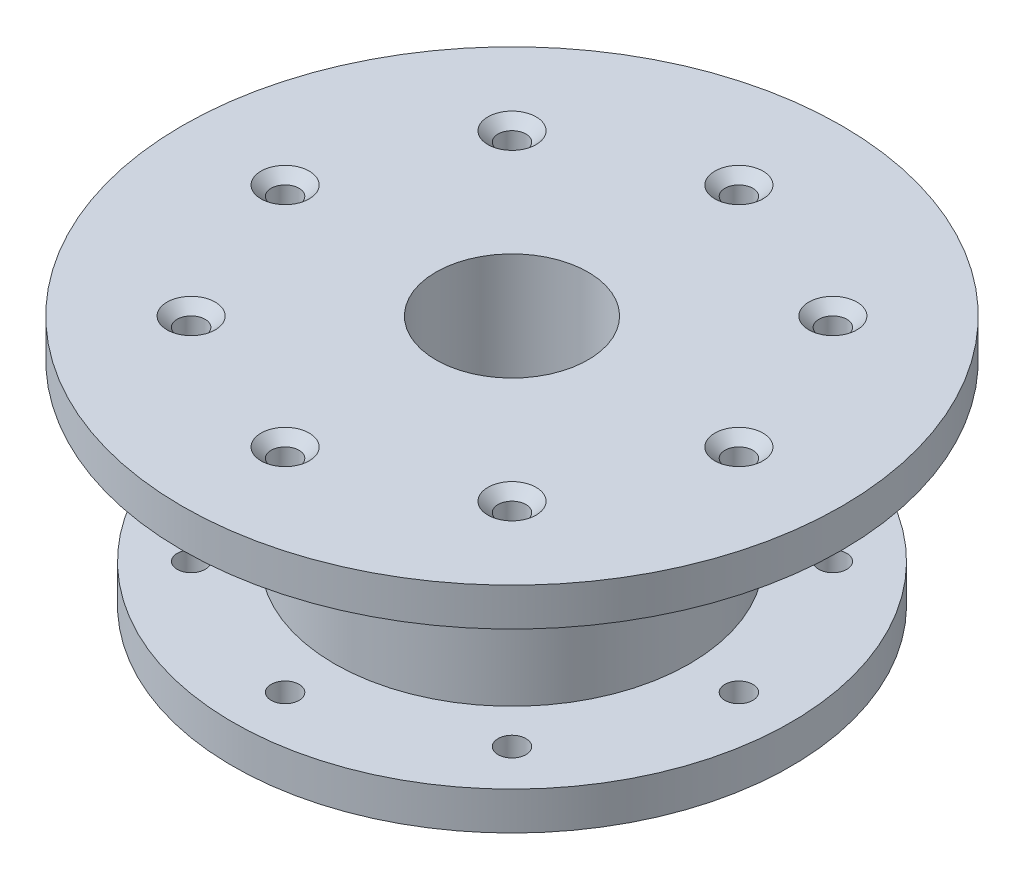
ISO-10303-21;
HEADER;
FILE_DESCRIPTION(('STEP AP214'),'2;1');
FILE_NAME('part.step','',(''),(''),'','','');
FILE_SCHEMA(('AUTOMOTIVE_DESIGN { 1 0 10303 214 1 1 1 1 }'));
ENDSEC;
DATA;
#1=APPLICATION_CONTEXT('core data for automotive mechanical design processes');
#2=APPLICATION_PROTOCOL_DEFINITION('international standard','automotive_design',2000,#1);
#3=PRODUCT_CONTEXT('',#1,'mechanical');
#4=PRODUCT('Part','Part','',(#3));
#5=PRODUCT_RELATED_PRODUCT_CATEGORY('part','',(#4));
#6=PRODUCT_DEFINITION_FORMATION('','',#4);
#7=PRODUCT_DEFINITION_CONTEXT('part definition',#1,'design');
#8=PRODUCT_DEFINITION('design','',#6,#7);
#9=PRODUCT_DEFINITION_SHAPE('','',#8);
#10=(LENGTH_UNIT() NAMED_UNIT(*) SI_UNIT(.MILLI.,.METRE.));
#11=(NAMED_UNIT(*) PLANE_ANGLE_UNIT() SI_UNIT($,.RADIAN.));
#12=(NAMED_UNIT(*) SI_UNIT($,.STERADIAN.) SOLID_ANGLE_UNIT());
#13=UNCERTAINTY_MEASURE_WITH_UNIT(LENGTH_MEASURE(1.E-05),#10,'distance_accuracy_value','');
#14=(GEOMETRIC_REPRESENTATION_CONTEXT(3) GLOBAL_UNCERTAINTY_ASSIGNED_CONTEXT((#13)) GLOBAL_UNIT_ASSIGNED_CONTEXT((#10,
#11,#12)) REPRESENTATION_CONTEXT('',''));
#15=CARTESIAN_POINT('',(0.,0.,0.));
#16=DIRECTION('',(0.,0.,1.));
#17=DIRECTION('',(1.,0.,0.));
#18=AXIS2_PLACEMENT_3D('',#15,#16,#17);
#19=CARTESIAN_POINT('',(13.1062182346386,42.025554223453,0.));
#20=DIRECTION('',(0.,-1.,0.));
#21=DIRECTION('',(1.,0.,0.));
#22=AXIS2_PLACEMENT_3D('',#19,#20,#21);
#23=PLANE('',#22);
#24=CARTESIAN_POINT('',(-16.8937817653604,42.025554223453,89.4603042940639));
#25=DIRECTION('',(0.,1.,0.));
#26=DIRECTION('',(0.,0.,1.));
#27=AXIS2_PLACEMENT_3D('',#24,#25,#26);
#28=CIRCLE('',#27,9.5);
#29=CARTESIAN_POINT('',(-16.8937817653604,42.025554223453,98.9603042940639));
#30=VERTEX_POINT('',#29);
#31=EDGE_CURVE('E333',#30,#30,#28,.T.);
#32=ORIENTED_EDGE('',*,*,#31,.F.);
#33=EDGE_LOOP('',(#32));
#34=FACE_BOUND('',#33,.T.);
#35=CARTESIAN_POINT('',(-106.354086059425,42.025554223453,0.));
#36=DIRECTION('',(0.,1.,0.));
#37=DIRECTION('',(0.,0.,1.));
#38=AXIS2_PLACEMENT_3D('',#35,#36,#37);
#39=CIRCLE('',#38,9.49999999999999);
#40=CARTESIAN_POINT('',(-106.354086059425,42.025554223453,9.49999999999999));
#41=VERTEX_POINT('',#40);
#42=EDGE_CURVE('E101',#41,#41,#39,.T.);
#43=ORIENTED_EDGE('',*,*,#42,.F.);
#44=EDGE_LOOP('',(#43));
#45=FACE_BOUND('',#44,.T.);
#46=CARTESIAN_POINT('',(-16.8937817653617,42.025554223453,-89.4603042940639));
#47=DIRECTION('',(0.,1.,0.));
#48=DIRECTION('',(0.,0.,1.));
#49=AXIS2_PLACEMENT_3D('',#46,#47,#48);
#50=CIRCLE('',#49,9.5);
#51=CARTESIAN_POINT('',(-16.8937817653617,42.025554223453,-79.9603042940639));
#52=VERTEX_POINT('',#51);
#53=EDGE_CURVE('E141',#52,#52,#50,.T.);
#54=ORIENTED_EDGE('',*,*,#53,.F.);
#55=EDGE_LOOP('',(#54));
#56=FACE_BOUND('',#55,.T.);
#57=CARTESIAN_POINT('',(46.3642060479831,42.025554223453,-63.2579878133447));
#58=DIRECTION('',(0.,1.,0.));
#59=DIRECTION('',(0.,0.,1.));
#60=AXIS2_PLACEMENT_3D('',#57,#58,#59);
#61=CIRCLE('',#60,9.5);
#62=CARTESIAN_POINT('',(46.3642060479831,42.025554223453,-53.7579878133447));
#63=VERTEX_POINT('',#62);
#64=EDGE_CURVE('E155',#63,#63,#61,.T.);
#65=ORIENTED_EDGE('',*,*,#64,.F.);
#66=EDGE_LOOP('',(#65));
#67=FACE_BOUND('',#66,.T.);
#68=CARTESIAN_POINT('',(72.5665225287025,42.025554223453,0.));
#69=DIRECTION('',(0.,1.,0.));
#70=DIRECTION('',(0.,0.,1.));
#71=AXIS2_PLACEMENT_3D('',#68,#69,#70);
#72=CIRCLE('',#71,9.49999999999999);
#73=CARTESIAN_POINT('',(72.5665225287025,42.025554223453,9.49999999999999));
#74=VERTEX_POINT('',#73);
#75=EDGE_CURVE('E169',#74,#74,#72,.T.);
#76=ORIENTED_EDGE('',*,*,#75,.F.);
#77=EDGE_LOOP('',(#76));
#78=FACE_BOUND('',#77,.T.);
#79=CARTESIAN_POINT('',(-16.8937817653614,42.025554223453,0.));
#80=DIRECTION('',(0.,1.,0.));
#81=DIRECTION('',(-1.,0.,0.));
#82=AXIS2_PLACEMENT_3D('',#79,#80,#81);
#83=CIRCLE('',#82,30.);
#84=CARTESIAN_POINT('',(-46.8937817653614,42.025554223453,0.));
#85=VERTEX_POINT('',#84);
#86=EDGE_CURVE('E183',#85,#85,#83,.T.);
#87=ORIENTED_EDGE('',*,*,#86,.F.);
#88=EDGE_LOOP('',(#87));
#89=FACE_BOUND('',#88,.T.);
#90=CARTESIAN_POINT('',(-16.8937817653614,42.025554223453,0.));
#91=DIRECTION('',(0.,1.,0.));
#92=DIRECTION('',(-1.,0.,0.));
#93=AXIS2_PLACEMENT_3D('',#90,#91,#92);
#94=CIRCLE('',#93,130.);
#95=CARTESIAN_POINT('',(-146.893781765361,42.025554223453,0.));
#96=VERTEX_POINT('',#95);
#97=EDGE_CURVE('E187',#96,#96,#94,.T.);
#98=ORIENTED_EDGE('',*,*,#97,.T.);
#99=EDGE_LOOP('',(#98));
#100=FACE_BOUND('',#99,.T.);
#101=CARTESIAN_POINT('',(-80.1517695787063,42.025554223453,-63.2579878133443));
#102=DIRECTION('',(0.,1.,0.));
#103=DIRECTION('',(0.,0.,1.));
#104=AXIS2_PLACEMENT_3D('',#101,#102,#103);
#105=CIRCLE('',#104,9.49999999999999);
#106=CARTESIAN_POINT('',(-80.1517695787063,42.025554223453,-53.7579878133443));
#107=VERTEX_POINT('',#106);
#108=EDGE_CURVE('E127',#107,#107,#105,.T.);
#109=ORIENTED_EDGE('',*,*,#108,.F.);
#110=EDGE_LOOP('',(#109));
#111=FACE_BOUND('',#110,.T.);
#112=CARTESIAN_POINT('',(-80.1517695787054,42.025554223453,63.2579878133451));
#113=DIRECTION('',(0.,1.,0.));
#114=DIRECTION('',(0.,0.,1.));
#115=AXIS2_PLACEMENT_3D('',#112,#113,#114);
#116=CIRCLE('',#115,9.49999999999999);
#117=CARTESIAN_POINT('',(-80.1517695787054,42.025554223453,72.7579878133451));
#118=VERTEX_POINT('',#117);
#119=EDGE_CURVE('E110',#118,#118,#116,.T.);
#120=ORIENTED_EDGE('',*,*,#119,.F.);
#121=EDGE_LOOP('',(#120));
#122=FACE_BOUND('',#121,.T.);
#123=CARTESIAN_POINT('',(46.364206047984,42.025554223453,63.2579878133438));
#124=DIRECTION('',(0.,1.,0.));
#125=DIRECTION('',(0.,0.,1.));
#126=AXIS2_PLACEMENT_3D('',#123,#124,#125);
#127=CIRCLE('',#126,9.5);
#128=CARTESIAN_POINT('',(46.364206047984,42.025554223453,72.7579878133438));
#129=VERTEX_POINT('',#128);
#130=EDGE_CURVE('E315',#129,#129,#127,.T.);
#131=ORIENTED_EDGE('',*,*,#130,.F.);
#132=EDGE_LOOP('',(#131));
#133=FACE_BOUND('',#132,.T.);
#134=ADVANCED_FACE('F43',(#34,#45,#56,#67,#78,#89,#100,#111,#122,#133),#23,.F.);
#135=CARTESIAN_POINT('',(-16.8937817653614,54.0055602525983,0.));
#136=DIRECTION('',(0.,1.,0.));
#137=DIRECTION('',(-1.,0.,0.));
#138=AXIS2_PLACEMENT_3D('',#135,#136,#137);
#139=CYLINDRICAL_SURFACE('',#138,30.);
#140=CARTESIAN_POINT('',(-16.8937817653614,-56.7604087709391,0.));
#141=DIRECTION('',(0.,1.,0.));
#142=DIRECTION('',(-1.,0.,0.));
#143=AXIS2_PLACEMENT_3D('',#140,#141,#142);
#144=CIRCLE('',#143,30.);
#145=CARTESIAN_POINT('',(-46.8937817653614,-56.7604087709391,0.));
#146=VERTEX_POINT('',#145);
#147=EDGE_CURVE('E10',#146,#146,#144,.T.);
#148=ORIENTED_EDGE('',*,*,#147,.F.);
#149=EDGE_LOOP('',(#148));
#150=FACE_BOUND('',#149,.T.);
#151=ORIENTED_EDGE('',*,*,#86,.T.);
#152=EDGE_LOOP('',(#151));
#153=FACE_BOUND('',#152,.T.);
#154=ADVANCED_FACE('F45',(#150,#153),#139,.F.);
#155=CARTESIAN_POINT('',(13.1062182346386,-56.7604087709391,0.));
#156=DIRECTION('',(0.,1.,0.));
#157=DIRECTION('',(-1.,0.,0.));
#158=AXIS2_PLACEMENT_3D('',#155,#156,#157);
#159=PLANE('',#158);
#160=CARTESIAN_POINT('',(46.364206047984,-56.7604087709391,63.2579878133438));
#161=DIRECTION('',(0.,1.,0.));
#162=DIRECTION('',(0.,0.,1.));
#163=AXIS2_PLACEMENT_3D('',#160,#161,#162);
#164=CIRCLE('',#163,5.49999999999997);
#165=CARTESIAN_POINT('',(46.364206047984,-56.7604087709391,68.7579878133438));
#166=VERTEX_POINT('',#165);
#167=EDGE_CURVE('E322',#166,#166,#164,.T.);
#168=ORIENTED_EDGE('',*,*,#167,.T.);
#169=EDGE_LOOP('',(#168));
#170=FACE_BOUND('',#169,.T.);
#171=CARTESIAN_POINT('',(-16.8937817653604,-56.7604087709391,89.4603042940639));
#172=DIRECTION('',(0.,1.,0.));
#173=DIRECTION('',(0.,0.,1.));
#174=AXIS2_PLACEMENT_3D('',#171,#172,#173);
#175=CIRCLE('',#174,5.49999999999997);
#176=CARTESIAN_POINT('',(-16.8937817653604,-56.7604087709391,94.9603042940638));
#177=VERTEX_POINT('',#176);
#178=EDGE_CURVE('E341',#177,#177,#175,.T.);
#179=ORIENTED_EDGE('',*,*,#178,.T.);
#180=EDGE_LOOP('',(#179));
#181=FACE_BOUND('',#180,.T.);
#182=CARTESIAN_POINT('',(-80.1517695787054,-56.7604087709392,63.2579878133451));
#183=DIRECTION('',(0.,1.,0.));
#184=DIRECTION('',(0.,0.,1.));
#185=AXIS2_PLACEMENT_3D('',#182,#183,#184);
#186=CIRCLE('',#185,5.49999999999998);
#187=CARTESIAN_POINT('',(-80.1517695787054,-56.7604087709392,68.7579878133451));
#188=VERTEX_POINT('',#187);
#189=EDGE_CURVE('E95',#188,#188,#186,.T.);
#190=ORIENTED_EDGE('',*,*,#189,.T.);
#191=EDGE_LOOP('',(#190));
#192=FACE_BOUND('',#191,.T.);
#193=CARTESIAN_POINT('',(-106.354086059425,-56.7604087709392,0.));
#194=DIRECTION('',(0.,1.,0.));
#195=DIRECTION('',(0.,0.,1.));
#196=AXIS2_PLACEMENT_3D('',#193,#194,#195);
#197=CIRCLE('',#196,5.49999999999998);
#198=CARTESIAN_POINT('',(-106.354086059425,-56.7604087709392,5.49999999999998));
#199=VERTEX_POINT('',#198);
#200=EDGE_CURVE('E90',#199,#199,#197,.T.);
#201=ORIENTED_EDGE('',*,*,#200,.T.);
#202=EDGE_LOOP('',(#201));
#203=FACE_BOUND('',#202,.T.);
#204=CARTESIAN_POINT('',(-80.1517695787063,-56.7604087709392,-63.2579878133443));
#205=DIRECTION('',(0.,1.,0.));
#206=DIRECTION('',(0.,0.,1.));
#207=AXIS2_PLACEMENT_3D('',#204,#205,#206);
#208=CIRCLE('',#207,5.49999999999998);
#209=CARTESIAN_POINT('',(-80.1517695787063,-56.7604087709392,-57.7579878133443));
#210=VERTEX_POINT('',#209);
#211=EDGE_CURVE('E85',#210,#210,#208,.T.);
#212=ORIENTED_EDGE('',*,*,#211,.T.);
#213=EDGE_LOOP('',(#212));
#214=FACE_BOUND('',#213,.T.);
#215=CARTESIAN_POINT('',(-16.8937817653617,-56.7604087709391,-89.4603042940639));
#216=DIRECTION('',(0.,1.,0.));
#217=DIRECTION('',(0.,0.,1.));
#218=AXIS2_PLACEMENT_3D('',#215,#216,#217);
#219=CIRCLE('',#218,5.49999999999997);
#220=CARTESIAN_POINT('',(-16.8937817653617,-56.7604087709391,-83.9603042940639));
#221=VERTEX_POINT('',#220);
#222=EDGE_CURVE('E79',#221,#221,#219,.T.);
#223=ORIENTED_EDGE('',*,*,#222,.T.);
#224=EDGE_LOOP('',(#223));
#225=FACE_BOUND('',#224,.T.);
#226=CARTESIAN_POINT('',(46.3642060479831,-56.7604087709391,-63.2579878133447));
#227=DIRECTION('',(0.,1.,0.));
#228=DIRECTION('',(0.,0.,1.));
#229=AXIS2_PLACEMENT_3D('',#226,#227,#228);
#230=CIRCLE('',#229,5.49999999999997);
#231=CARTESIAN_POINT('',(46.3642060479831,-56.7604087709391,-57.7579878133447));
#232=VERTEX_POINT('',#231);
#233=EDGE_CURVE('E73',#232,#232,#230,.T.);
#234=ORIENTED_EDGE('',*,*,#233,.T.);
#235=EDGE_LOOP('',(#234));
#236=FACE_BOUND('',#235,.T.);
#237=CARTESIAN_POINT('',(72.5665225287025,-56.7604087709391,0.));
#238=DIRECTION('',(0.,1.,0.));
#239=DIRECTION('',(0.,0.,1.));
#240=AXIS2_PLACEMENT_3D('',#237,#238,#239);
#241=CIRCLE('',#240,5.50000000000001);
#242=CARTESIAN_POINT('',(72.5665225287025,-56.7604087709391,5.50000000000001));
#243=VERTEX_POINT('',#242);
#244=EDGE_CURVE('E67',#243,#243,#241,.T.);
#245=ORIENTED_EDGE('',*,*,#244,.T.);
#246=EDGE_LOOP('',(#245));
#247=FACE_BOUND('',#246,.T.);
#248=CARTESIAN_POINT('',(-16.8937817653614,-56.7604087709391,0.));
#249=DIRECTION('',(0.,1.,0.));
#250=DIRECTION('',(-1.,0.,0.));
#251=AXIS2_PLACEMENT_3D('',#248,#249,#250);
#252=CIRCLE('',#251,110.);
#253=CARTESIAN_POINT('',(-126.893781765361,-56.7604087709391,0.));
#254=VERTEX_POINT('',#253);
#255=EDGE_CURVE('E52',#254,#254,#252,.T.);
#256=ORIENTED_EDGE('',*,*,#255,.F.);
#257=EDGE_LOOP('',(#256));
#258=FACE_BOUND('',#257,.T.);
#259=ORIENTED_EDGE('',*,*,#147,.T.);
#260=EDGE_LOOP('',(#259));
#261=FACE_BOUND('',#260,.T.);
#262=ADVANCED_FACE('F211',(#170,#181,#192,#203,#214,#225,#236,#247,#258,#261),#159,.F.);
#263=CARTESIAN_POINT('',(-16.8937817653614,54.0055602525983,0.));
#264=DIRECTION('',(0.,1.,0.));
#265=DIRECTION('',(-1.,0.,0.));
#266=AXIS2_PLACEMENT_3D('',#263,#264,#265);
#267=CYLINDRICAL_SURFACE('',#266,110.);
#268=CARTESIAN_POINT('',(-16.8937817653614,-41.7604087709391,0.));
#269=DIRECTION('',(0.,1.,0.));
#270=DIRECTION('',(-1.,0.,0.));
#271=AXIS2_PLACEMENT_3D('',#268,#269,#270);
#272=CIRCLE('',#271,110.);
#273=CARTESIAN_POINT('',(-126.893781765361,-41.7604087709391,0.));
#274=VERTEX_POINT('',#273);
#275=EDGE_CURVE('E58',#274,#274,#272,.T.);
#276=ORIENTED_EDGE('',*,*,#275,.F.);
#277=EDGE_LOOP('',(#276));
#278=FACE_BOUND('',#277,.T.);
#279=ORIENTED_EDGE('',*,*,#255,.T.);
#280=EDGE_LOOP('',(#279));
#281=FACE_BOUND('',#280,.T.);
#282=ADVANCED_FACE('F208',(#278,#281),#267,.T.);
#283=CARTESIAN_POINT('',(53.1062182346386,-41.7604087709391,0.));
#284=DIRECTION('',(0.,-1.,0.));
#285=DIRECTION('',(1.,0.,0.));
#286=AXIS2_PLACEMENT_3D('',#283,#284,#285);
#287=PLANE('',#286);
#288=CARTESIAN_POINT('',(46.364206047984,-41.7604087709391,63.2579878133438));
#289=DIRECTION('',(0.,-1.,0.));
#290=DIRECTION('',(1.,0.,0.));
#291=AXIS2_PLACEMENT_3D('',#288,#289,#290);
#292=CIRCLE('',#291,5.49999999999998);
#293=CARTESIAN_POINT('',(51.864206047984,-41.7604087709391,63.2579878133438));
#294=VERTEX_POINT('',#293);
#295=EDGE_CURVE('E255',#294,#294,#292,.T.);
#296=ORIENTED_EDGE('',*,*,#295,.T.);
#297=EDGE_LOOP('',(#296));
#298=FACE_BOUND('',#297,.T.);
#299=CARTESIAN_POINT('',(-16.8937817653604,-41.7604087709391,89.4603042940639));
#300=DIRECTION('',(0.,-1.,0.));
#301=DIRECTION('',(1.,0.,0.));
#302=AXIS2_PLACEMENT_3D('',#299,#300,#301);
#303=CIRCLE('',#302,5.49999999999998);
#304=CARTESIAN_POINT('',(-11.3937817653605,-41.7604087709391,89.4603042940639));
#305=VERTEX_POINT('',#304);
#306=EDGE_CURVE('E47',#305,#305,#303,.T.);
#307=ORIENTED_EDGE('',*,*,#306,.T.);
#308=EDGE_LOOP('',(#307));
#309=FACE_BOUND('',#308,.T.);
#310=CARTESIAN_POINT('',(-80.1517695787054,-41.7604087709391,63.2579878133451));
#311=DIRECTION('',(0.,-1.,0.));
#312=DIRECTION('',(1.,0.,0.));
#313=AXIS2_PLACEMENT_3D('',#310,#311,#312);
#314=CIRCLE('',#313,5.49999999999999);
#315=CARTESIAN_POINT('',(-74.6517695787054,-41.7604087709391,63.2579878133451));
#316=VERTEX_POINT('',#315);
#317=EDGE_CURVE('E94',#316,#316,#314,.T.);
#318=ORIENTED_EDGE('',*,*,#317,.T.);
#319=EDGE_LOOP('',(#318));
#320=FACE_BOUND('',#319,.T.);
#321=CARTESIAN_POINT('',(-106.354086059425,-41.7604087709391,0.));
#322=DIRECTION('',(0.,-1.,0.));
#323=DIRECTION('',(1.,0.,0.));
#324=AXIS2_PLACEMENT_3D('',#321,#322,#323);
#325=CIRCLE('',#324,5.49999999999999);
#326=CARTESIAN_POINT('',(-100.854086059425,-41.7604087709391,0.));
#327=VERTEX_POINT('',#326);
#328=EDGE_CURVE('E89',#327,#327,#325,.T.);
#329=ORIENTED_EDGE('',*,*,#328,.T.);
#330=EDGE_LOOP('',(#329));
#331=FACE_BOUND('',#330,.T.);
#332=CARTESIAN_POINT('',(-80.1517695787063,-41.7604087709391,-63.2579878133443));
#333=DIRECTION('',(0.,-1.,0.));
#334=DIRECTION('',(1.,0.,0.));
#335=AXIS2_PLACEMENT_3D('',#332,#333,#334);
#336=CIRCLE('',#335,5.49999999999999);
#337=CARTESIAN_POINT('',(-74.6517695787063,-41.7604087709391,-63.2579878133443));
#338=VERTEX_POINT('',#337);
#339=EDGE_CURVE('E80',#338,#338,#336,.T.);
#340=ORIENTED_EDGE('',*,*,#339,.T.);
#341=EDGE_LOOP('',(#340));
#342=FACE_BOUND('',#341,.T.);
#343=CARTESIAN_POINT('',(-16.8937817653617,-41.7604087709391,-89.4603042940639));
#344=DIRECTION('',(0.,-1.,0.));
#345=DIRECTION('',(1.,0.,0.));
#346=AXIS2_PLACEMENT_3D('',#343,#344,#345);
#347=CIRCLE('',#346,5.49999999999998);
#348=CARTESIAN_POINT('',(-11.3937817653617,-41.7604087709391,-89.4603042940639));
#349=VERTEX_POINT('',#348);
#350=EDGE_CURVE('E78',#349,#349,#347,.T.);
#351=ORIENTED_EDGE('',*,*,#350,.T.);
#352=EDGE_LOOP('',(#351));
#353=FACE_BOUND('',#352,.T.);
#354=CARTESIAN_POINT('',(46.3642060479831,-41.7604087709391,-63.2579878133447));
#355=DIRECTION('',(0.,-1.,0.));
#356=DIRECTION('',(1.,0.,0.));
#357=AXIS2_PLACEMENT_3D('',#354,#355,#356);
#358=CIRCLE('',#357,5.49999999999998);
#359=CARTESIAN_POINT('',(51.8642060479831,-41.7604087709391,-63.2579878133447));
#360=VERTEX_POINT('',#359);
#361=EDGE_CURVE('E72',#360,#360,#358,.T.);
#362=ORIENTED_EDGE('',*,*,#361,.T.);
#363=EDGE_LOOP('',(#362));
#364=FACE_BOUND('',#363,.T.);
#365=CARTESIAN_POINT('',(72.5665225287025,-41.7604087709391,0.));
#366=DIRECTION('',(0.,-1.,0.));
#367=DIRECTION('',(1.,0.,0.));
#368=AXIS2_PLACEMENT_3D('',#365,#366,#367);
#369=CIRCLE('',#368,5.50000000000001);
#370=CARTESIAN_POINT('',(78.0665225287025,-41.7604087709391,0.));
#371=VERTEX_POINT('',#370);
#372=EDGE_CURVE('E66',#371,#371,#369,.T.);
#373=ORIENTED_EDGE('',*,*,#372,.T.);
#374=EDGE_LOOP('',(#373));
#375=FACE_BOUND('',#374,.T.);
#376=CARTESIAN_POINT('',(-16.8937817653614,-41.7604087709391,0.));
#377=DIRECTION('',(0.,1.,0.));
#378=DIRECTION('',(-1.,0.,0.));
#379=AXIS2_PLACEMENT_3D('',#376,#377,#378);
#380=CIRCLE('',#379,70.);
#381=CARTESIAN_POINT('',(-86.8937817653614,-41.7604087709391,0.));
#382=VERTEX_POINT('',#381);
#383=EDGE_CURVE('E199',#382,#382,#380,.T.);
#384=ORIENTED_EDGE('',*,*,#383,.F.);
#385=EDGE_LOOP('',(#384));
#386=FACE_BOUND('',#385,.T.);
#387=ORIENTED_EDGE('',*,*,#275,.T.);
#388=EDGE_LOOP('',(#387));
#389=FACE_BOUND('',#388,.T.);
#390=ADVANCED_FACE('F206',(#298,#309,#320,#331,#342,#353,#364,#375,#386,#389),#287,.F.);
#391=CARTESIAN_POINT('',(-16.8937817653614,54.0055602525983,0.));
#392=DIRECTION('',(0.,1.,0.));
#393=DIRECTION('',(-1.,0.,0.));
#394=AXIS2_PLACEMENT_3D('',#391,#392,#393);
#395=CYLINDRICAL_SURFACE('',#394,70.);
#396=CARTESIAN_POINT('',(-16.8937817653614,27.025554223453,0.));
#397=DIRECTION('',(0.,1.,0.));
#398=DIRECTION('',(-1.,0.,0.));
#399=AXIS2_PLACEMENT_3D('',#396,#397,#398);
#400=CIRCLE('',#399,70.);
#401=CARTESIAN_POINT('',(-86.8937817653614,27.025554223453,0.));
#402=VERTEX_POINT('',#401);
#403=EDGE_CURVE('E195',#402,#402,#400,.T.);
#404=ORIENTED_EDGE('',*,*,#403,.F.);
#405=EDGE_LOOP('',(#404));
#406=FACE_BOUND('',#405,.T.);
#407=ORIENTED_EDGE('',*,*,#383,.T.);
#408=EDGE_LOOP('',(#407));
#409=FACE_BOUND('',#408,.T.);
#410=ADVANCED_FACE('F244',(#406,#409),#395,.T.);
#411=CARTESIAN_POINT('',(113.106218234639,27.025554223453,0.));
#412=DIRECTION('',(0.,1.,0.));
#413=DIRECTION('',(-1.,0.,0.));
#414=AXIS2_PLACEMENT_3D('',#411,#412,#413);
#415=PLANE('',#414);
#416=CARTESIAN_POINT('',(46.364206047984,27.025554223453,63.2579878133438));
#417=DIRECTION('',(0.,1.,0.));
#418=DIRECTION('',(-1.,0.,0.));
#419=AXIS2_PLACEMENT_3D('',#416,#417,#418);
#420=CIRCLE('',#419,5.49999999999998);
#421=CARTESIAN_POINT('',(40.864206047984,27.025554223453,63.2579878133438));
#422=VERTEX_POINT('',#421);
#423=EDGE_CURVE('E327',#422,#422,#420,.T.);
#424=ORIENTED_EDGE('',*,*,#423,.T.);
#425=EDGE_LOOP('',(#424));
#426=FACE_BOUND('',#425,.T.);
#427=CARTESIAN_POINT('',(-16.8937817653604,27.025554223453,89.4603042940639));
#428=DIRECTION('',(0.,1.,0.));
#429=DIRECTION('',(-1.,0.,0.));
#430=AXIS2_PLACEMENT_3D('',#427,#428,#429);
#431=CIRCLE('',#430,5.49999999999998);
#432=CARTESIAN_POINT('',(-22.3937817653604,27.025554223453,89.4603042940639));
#433=VERTEX_POINT('',#432);
#434=EDGE_CURVE('E345',#433,#433,#431,.T.);
#435=ORIENTED_EDGE('',*,*,#434,.T.);
#436=EDGE_LOOP('',(#435));
#437=FACE_BOUND('',#436,.T.);
#438=CARTESIAN_POINT('',(-80.1517695787054,27.025554223453,63.2579878133451));
#439=DIRECTION('',(0.,1.,0.));
#440=DIRECTION('',(-1.,0.,0.));
#441=AXIS2_PLACEMENT_3D('',#438,#439,#440);
#442=CIRCLE('',#441,5.49999999999999);
#443=CARTESIAN_POINT('',(-85.6517695787054,27.025554223453,63.2579878133451));
#444=VERTEX_POINT('',#443);
#445=EDGE_CURVE('E91',#444,#444,#442,.T.);
#446=ORIENTED_EDGE('',*,*,#445,.T.);
#447=EDGE_LOOP('',(#446));
#448=FACE_BOUND('',#447,.T.);
#449=CARTESIAN_POINT('',(-106.354086059425,27.025554223453,0.));
#450=DIRECTION('',(0.,1.,0.));
#451=DIRECTION('',(-1.,0.,0.));
#452=AXIS2_PLACEMENT_3D('',#449,#450,#451);
#453=CIRCLE('',#452,5.49999999999999);
#454=CARTESIAN_POINT('',(-111.854086059425,27.025554223453,0.));
#455=VERTEX_POINT('',#454);
#456=EDGE_CURVE('E86',#455,#455,#453,.T.);
#457=ORIENTED_EDGE('',*,*,#456,.T.);
#458=EDGE_LOOP('',(#457));
#459=FACE_BOUND('',#458,.T.);
#460=CARTESIAN_POINT('',(-80.1517695787063,27.025554223453,-63.2579878133443));
#461=DIRECTION('',(0.,1.,0.));
#462=DIRECTION('',(-1.,0.,0.));
#463=AXIS2_PLACEMENT_3D('',#460,#461,#462);
#464=CIRCLE('',#463,5.49999999999999);
#465=CARTESIAN_POINT('',(-85.6517695787063,27.025554223453,-63.2579878133443));
#466=VERTEX_POINT('',#465);
#467=EDGE_CURVE('E84',#466,#466,#464,.T.);
#468=ORIENTED_EDGE('',*,*,#467,.T.);
#469=EDGE_LOOP('',(#468));
#470=FACE_BOUND('',#469,.T.);
#471=CARTESIAN_POINT('',(-16.8937817653617,27.025554223453,-89.4603042940639));
#472=DIRECTION('',(0.,1.,0.));
#473=DIRECTION('',(-1.,0.,0.));
#474=AXIS2_PLACEMENT_3D('',#471,#472,#473);
#475=CIRCLE('',#474,5.49999999999998);
#476=CARTESIAN_POINT('',(-22.3937817653617,27.025554223453,-89.4603042940639));
#477=VERTEX_POINT('',#476);
#478=EDGE_CURVE('E74',#477,#477,#475,.T.);
#479=ORIENTED_EDGE('',*,*,#478,.T.);
#480=EDGE_LOOP('',(#479));
#481=FACE_BOUND('',#480,.T.);
#482=CARTESIAN_POINT('',(46.3642060479831,27.025554223453,-63.2579878133447));
#483=DIRECTION('',(0.,1.,0.));
#484=DIRECTION('',(-1.,0.,0.));
#485=AXIS2_PLACEMENT_3D('',#482,#483,#484);
#486=CIRCLE('',#485,5.49999999999998);
#487=CARTESIAN_POINT('',(40.8642060479831,27.025554223453,-63.2579878133447));
#488=VERTEX_POINT('',#487);
#489=EDGE_CURVE('E68',#488,#488,#486,.T.);
#490=ORIENTED_EDGE('',*,*,#489,.T.);
#491=EDGE_LOOP('',(#490));
#492=FACE_BOUND('',#491,.T.);
#493=CARTESIAN_POINT('',(72.5665225287025,27.025554223453,0.));
#494=DIRECTION('',(0.,1.,0.));
#495=DIRECTION('',(-1.,0.,0.));
#496=AXIS2_PLACEMENT_3D('',#493,#494,#495);
#497=CIRCLE('',#496,5.50000000000001);
#498=CARTESIAN_POINT('',(67.0665225287025,27.025554223453,0.));
#499=VERTEX_POINT('',#498);
#500=EDGE_CURVE('E62',#499,#499,#497,.T.);
#501=ORIENTED_EDGE('',*,*,#500,.T.);
#502=EDGE_LOOP('',(#501));
#503=FACE_BOUND('',#502,.T.);
#504=CARTESIAN_POINT('',(-16.8937817653614,27.025554223453,0.));
#505=DIRECTION('',(0.,1.,0.));
#506=DIRECTION('',(-1.,0.,0.));
#507=AXIS2_PLACEMENT_3D('',#504,#505,#506);
#508=CIRCLE('',#507,130.);
#509=CARTESIAN_POINT('',(-146.893781765361,27.025554223453,0.));
#510=VERTEX_POINT('',#509);
#511=EDGE_CURVE('E191',#510,#510,#508,.T.);
#512=ORIENTED_EDGE('',*,*,#511,.F.);
#513=EDGE_LOOP('',(#512));
#514=FACE_BOUND('',#513,.T.);
#515=ORIENTED_EDGE('',*,*,#403,.T.);
#516=EDGE_LOOP('',(#515));
#517=FACE_BOUND('',#516,.T.);
#518=ADVANCED_FACE('F240',(#426,#437,#448,#459,#470,#481,#492,#503,#514,#517),#415,.F.);
#519=CARTESIAN_POINT('',(-16.8937817653614,54.0055602525983,0.));
#520=DIRECTION('',(0.,1.,0.));
#521=DIRECTION('',(-1.,0.,0.));
#522=AXIS2_PLACEMENT_3D('',#519,#520,#521);
#523=CYLINDRICAL_SURFACE('',#522,130.);
#524=ORIENTED_EDGE('',*,*,#97,.F.);
#525=EDGE_LOOP('',(#524));
#526=FACE_BOUND('',#525,.T.);
#527=ORIENTED_EDGE('',*,*,#511,.T.);
#528=EDGE_LOOP('',(#527));
#529=FACE_BOUND('',#528,.T.);
#530=ADVANCED_FACE('F236',(#526,#529),#523,.T.);
#531=CARTESIAN_POINT('',(72.5665225287025,42.025554223453,0.));
#532=DIRECTION('',(0.,1.,0.));
#533=DIRECTION('',(0.,0.,1.));
#534=AXIS2_PLACEMENT_3D('',#531,#532,#533);
#535=CONICAL_SURFACE('',#534,9.49999999999999,0.802851455917391);
#536=CARTESIAN_POINT('',(72.5665225287025,38.1627991242247,0.));
#537=DIRECTION('',(0.,1.,0.));
#538=DIRECTION('',(0.,0.,1.));
#539=AXIS2_PLACEMENT_3D('',#536,#537,#538);
#540=CIRCLE('',#539,5.50000000000001);
#541=CARTESIAN_POINT('',(72.5665225287025,38.1627991242247,5.50000000000001));
#542=VERTEX_POINT('',#541);
#543=EDGE_CURVE('E173',#542,#542,#540,.T.);
#544=ORIENTED_EDGE('',*,*,#543,.F.);
#545=EDGE_LOOP('',(#544));
#546=FACE_BOUND('',#545,.T.);
#547=ORIENTED_EDGE('',*,*,#75,.T.);
#548=EDGE_LOOP('',(#547));
#549=FACE_BOUND('',#548,.T.);
#550=ADVANCED_FACE('F239',(#546,#549),#535,.F.);
#551=CARTESIAN_POINT('',(72.5665225287025,42.025554223453,0.));
#552=DIRECTION('',(0.,1.,0.));
#553=DIRECTION('',(0.,0.,1.));
#554=AXIS2_PLACEMENT_3D('',#551,#552,#553);
#555=CYLINDRICAL_SURFACE('',#554,5.50000000000001);
#556=ORIENTED_EDGE('',*,*,#543,.T.);
#557=EDGE_LOOP('',(#556));
#558=FACE_BOUND('',#557,.T.);
#559=ORIENTED_EDGE('',*,*,#500,.F.);
#560=EDGE_LOOP('',(#559));
#561=FACE_BOUND('',#560,.T.);
#562=ADVANCED_FACE('F275',(#558,#561),#555,.F.);
#563=ORIENTED_EDGE('',*,*,#244,.F.);
#564=EDGE_LOOP('',(#563));
#565=FACE_BOUND('',#564,.T.);
#566=ORIENTED_EDGE('',*,*,#372,.F.);
#567=EDGE_LOOP('',(#566));
#568=FACE_BOUND('',#567,.T.);
#569=ADVANCED_FACE('F234',(#565,#568),#555,.F.);
#570=CARTESIAN_POINT('',(46.3642060479831,42.025554223453,-63.2579878133447));
#571=DIRECTION('',(0.,1.,0.));
#572=DIRECTION('',(0.,0.,1.));
#573=AXIS2_PLACEMENT_3D('',#570,#571,#572);
#574=CONICAL_SURFACE('',#573,9.5,0.802851455917393);
#575=CARTESIAN_POINT('',(46.3642060479831,38.1627991242247,-63.2579878133447));
#576=DIRECTION('',(0.,1.,0.));
#577=DIRECTION('',(0.,0.,1.));
#578=AXIS2_PLACEMENT_3D('',#575,#576,#577);
#579=CIRCLE('',#578,5.5);
#580=CARTESIAN_POINT('',(46.3642060479831,38.1627991242247,-57.7579878133447));
#581=VERTEX_POINT('',#580);
#582=EDGE_CURVE('E159',#581,#581,#579,.T.);
#583=ORIENTED_EDGE('',*,*,#582,.F.);
#584=EDGE_LOOP('',(#583));
#585=FACE_BOUND('',#584,.T.);
#586=ORIENTED_EDGE('',*,*,#64,.T.);
#587=EDGE_LOOP('',(#586));
#588=FACE_BOUND('',#587,.T.);
#589=ADVANCED_FACE('F274',(#585,#588),#574,.F.);
#590=CARTESIAN_POINT('',(46.3642060479831,42.025554223453,-63.2579878133447));
#591=DIRECTION('',(0.,1.,0.));
#592=DIRECTION('',(0.,0.,1.));
#593=AXIS2_PLACEMENT_3D('',#590,#591,#592);
#594=CYLINDRICAL_SURFACE('',#593,5.49999999999998);
#595=ORIENTED_EDGE('',*,*,#582,.T.);
#596=EDGE_LOOP('',(#595));
#597=FACE_BOUND('',#596,.T.);
#598=ORIENTED_EDGE('',*,*,#489,.F.);
#599=EDGE_LOOP('',(#598));
#600=FACE_BOUND('',#599,.T.);
#601=ADVANCED_FACE('F281',(#597,#600),#594,.F.);
#602=ORIENTED_EDGE('',*,*,#233,.F.);
#603=EDGE_LOOP('',(#602));
#604=FACE_BOUND('',#603,.T.);
#605=ORIENTED_EDGE('',*,*,#361,.F.);
#606=EDGE_LOOP('',(#605));
#607=FACE_BOUND('',#606,.T.);
#608=ADVANCED_FACE('F391',(#604,#607),#594,.F.);
#609=CARTESIAN_POINT('',(-16.8937817653617,42.025554223453,-89.4603042940639));
#610=DIRECTION('',(0.,1.,0.));
#611=DIRECTION('',(0.,0.,1.));
#612=AXIS2_PLACEMENT_3D('',#609,#610,#611);
#613=CONICAL_SURFACE('',#612,9.5,0.802851455917393);
#614=CARTESIAN_POINT('',(-16.8937817653617,38.1627991242247,-89.4603042940639));
#615=DIRECTION('',(0.,1.,0.));
#616=DIRECTION('',(0.,0.,1.));
#617=AXIS2_PLACEMENT_3D('',#614,#615,#616);
#618=CIRCLE('',#617,5.5);
#619=CARTESIAN_POINT('',(-16.8937817653617,38.1627991242247,-83.9603042940639));
#620=VERTEX_POINT('',#619);
#621=EDGE_CURVE('E145',#620,#620,#618,.T.);
#622=ORIENTED_EDGE('',*,*,#621,.F.);
#623=EDGE_LOOP('',(#622));
#624=FACE_BOUND('',#623,.T.);
#625=ORIENTED_EDGE('',*,*,#53,.T.);
#626=EDGE_LOOP('',(#625));
#627=FACE_BOUND('',#626,.T.);
#628=ADVANCED_FACE('F387',(#624,#627),#613,.F.);
#629=CARTESIAN_POINT('',(-16.8937817653617,42.025554223453,-89.4603042940639));
#630=DIRECTION('',(0.,1.,0.));
#631=DIRECTION('',(0.,0.,1.));
#632=AXIS2_PLACEMENT_3D('',#629,#630,#631);
#633=CYLINDRICAL_SURFACE('',#632,5.49999999999998);
#634=ORIENTED_EDGE('',*,*,#621,.T.);
#635=EDGE_LOOP('',(#634));
#636=FACE_BOUND('',#635,.T.);
#637=ORIENTED_EDGE('',*,*,#478,.F.);
#638=EDGE_LOOP('',(#637));
#639=FACE_BOUND('',#638,.T.);
#640=ADVANCED_FACE('F390',(#636,#639),#633,.F.);
#641=ORIENTED_EDGE('',*,*,#222,.F.);
#642=EDGE_LOOP('',(#641));
#643=FACE_BOUND('',#642,.T.);
#644=ORIENTED_EDGE('',*,*,#350,.F.);
#645=EDGE_LOOP('',(#644));
#646=FACE_BOUND('',#645,.T.);
#647=ADVANCED_FACE('F393',(#643,#646),#633,.F.);
#648=CARTESIAN_POINT('',(-80.1517695787063,42.025554223453,-63.2579878133443));
#649=DIRECTION('',(0.,1.,0.));
#650=DIRECTION('',(0.,0.,1.));
#651=AXIS2_PLACEMENT_3D('',#648,#649,#650);
#652=CYLINDRICAL_SURFACE('',#651,5.49999999999999);
#653=ORIENTED_EDGE('',*,*,#211,.F.);
#654=EDGE_LOOP('',(#653));
#655=FACE_BOUND('',#654,.T.);
#656=ORIENTED_EDGE('',*,*,#339,.F.);
#657=EDGE_LOOP('',(#656));
#658=FACE_BOUND('',#657,.T.);
#659=ADVANCED_FACE('F385',(#655,#658),#652,.F.);
#660=CARTESIAN_POINT('',(-80.1517695787063,38.1627991242247,-63.2579878133443));
#661=DIRECTION('',(0.,1.,0.));
#662=DIRECTION('',(0.,0.,1.));
#663=AXIS2_PLACEMENT_3D('',#660,#661,#662);
#664=CIRCLE('',#663,5.50000000000001);
#665=CARTESIAN_POINT('',(-80.1517695787063,38.1627991242247,-57.7579878133443));
#666=VERTEX_POINT('',#665);
#667=EDGE_CURVE('E131',#666,#666,#664,.T.);
#668=ORIENTED_EDGE('',*,*,#667,.T.);
#669=EDGE_LOOP('',(#668));
#670=FACE_BOUND('',#669,.T.);
#671=ORIENTED_EDGE('',*,*,#467,.F.);
#672=EDGE_LOOP('',(#671));
#673=FACE_BOUND('',#672,.T.);
#674=ADVANCED_FACE('F381',(#670,#673),#652,.F.);
#675=CARTESIAN_POINT('',(-80.1517695787063,42.025554223453,-63.2579878133443));
#676=DIRECTION('',(0.,1.,0.));
#677=DIRECTION('',(0.,0.,1.));
#678=AXIS2_PLACEMENT_3D('',#675,#676,#677);
#679=CONICAL_SURFACE('',#678,9.49999999999999,0.802851455917391);
#680=ORIENTED_EDGE('',*,*,#667,.F.);
#681=EDGE_LOOP('',(#680));
#682=FACE_BOUND('',#681,.T.);
#683=ORIENTED_EDGE('',*,*,#108,.T.);
#684=EDGE_LOOP('',(#683));
#685=FACE_BOUND('',#684,.T.);
#686=ADVANCED_FACE('F378',(#682,#685),#679,.F.);
#687=CARTESIAN_POINT('',(-106.354086059425,42.025554223453,0.));
#688=DIRECTION('',(0.,1.,0.));
#689=DIRECTION('',(0.,0.,1.));
#690=AXIS2_PLACEMENT_3D('',#687,#688,#689);
#691=CYLINDRICAL_SURFACE('',#690,5.49999999999999);
#692=CARTESIAN_POINT('',(-106.354086059425,38.1627991242247,0.));
#693=DIRECTION('',(0.,1.,0.));
#694=DIRECTION('',(0.,0.,1.));
#695=AXIS2_PLACEMENT_3D('',#692,#693,#694);
#696=CIRCLE('',#695,5.50000000000001);
#697=CARTESIAN_POINT('',(-106.354086059425,38.1627991242247,5.50000000000001));
#698=VERTEX_POINT('',#697);
#699=EDGE_CURVE('E117',#698,#698,#696,.T.);
#700=ORIENTED_EDGE('',*,*,#699,.T.);
#701=EDGE_LOOP('',(#700));
#702=FACE_BOUND('',#701,.T.);
#703=ORIENTED_EDGE('',*,*,#456,.F.);
#704=EDGE_LOOP('',(#703));
#705=FACE_BOUND('',#704,.T.);
#706=ADVANCED_FACE('F366',(#702,#705),#691,.F.);
#707=CARTESIAN_POINT('',(-106.354086059425,42.025554223453,0.));
#708=DIRECTION('',(0.,1.,0.));
#709=DIRECTION('',(0.,0.,1.));
#710=AXIS2_PLACEMENT_3D('',#707,#708,#709);
#711=CONICAL_SURFACE('',#710,9.49999999999999,0.802851455917391);
#712=ORIENTED_EDGE('',*,*,#699,.F.);
#713=EDGE_LOOP('',(#712));
#714=FACE_BOUND('',#713,.T.);
#715=ORIENTED_EDGE('',*,*,#42,.T.);
#716=EDGE_LOOP('',(#715));
#717=FACE_BOUND('',#716,.T.);
#718=ADVANCED_FACE('F363',(#714,#717),#711,.F.);
#719=ORIENTED_EDGE('',*,*,#200,.F.);
#720=EDGE_LOOP('',(#719));
#721=FACE_BOUND('',#720,.T.);
#722=ORIENTED_EDGE('',*,*,#328,.F.);
#723=EDGE_LOOP('',(#722));
#724=FACE_BOUND('',#723,.T.);
#725=ADVANCED_FACE('F353',(#721,#724),#691,.F.);
#726=CARTESIAN_POINT('',(-80.1517695787054,42.025554223453,63.2579878133451));
#727=DIRECTION('',(0.,1.,0.));
#728=DIRECTION('',(0.,0.,1.));
#729=AXIS2_PLACEMENT_3D('',#726,#727,#728);
#730=CONICAL_SURFACE('',#729,9.49999999999999,0.802851455917391);
#731=CARTESIAN_POINT('',(-80.1517695787054,38.1627991242247,63.2579878133451));
#732=DIRECTION('',(0.,1.,0.));
#733=DIRECTION('',(0.,0.,1.));
#734=AXIS2_PLACEMENT_3D('',#731,#732,#733);
#735=CIRCLE('',#734,5.50000000000001);
#736=CARTESIAN_POINT('',(-80.1517695787054,38.1627991242247,68.7579878133452));
#737=VERTEX_POINT('',#736);
#738=EDGE_CURVE('E104',#737,#737,#735,.T.);
#739=ORIENTED_EDGE('',*,*,#738,.F.);
#740=EDGE_LOOP('',(#739));
#741=FACE_BOUND('',#740,.T.);
#742=ORIENTED_EDGE('',*,*,#119,.T.);
#743=EDGE_LOOP('',(#742));
#744=FACE_BOUND('',#743,.T.);
#745=ADVANCED_FACE('F350',(#741,#744),#730,.F.);
#746=CARTESIAN_POINT('',(-80.1517695787054,42.025554223453,63.2579878133451));
#747=DIRECTION('',(0.,1.,0.));
#748=DIRECTION('',(0.,0.,1.));
#749=AXIS2_PLACEMENT_3D('',#746,#747,#748);
#750=CYLINDRICAL_SURFACE('',#749,5.49999999999999);
#751=ORIENTED_EDGE('',*,*,#738,.T.);
#752=EDGE_LOOP('',(#751));
#753=FACE_BOUND('',#752,.T.);
#754=ORIENTED_EDGE('',*,*,#445,.F.);
#755=EDGE_LOOP('',(#754));
#756=FACE_BOUND('',#755,.T.);
#757=ADVANCED_FACE('F352',(#753,#756),#750,.F.);
#758=ORIENTED_EDGE('',*,*,#189,.F.);
#759=EDGE_LOOP('',(#758));
#760=FACE_BOUND('',#759,.T.);
#761=ORIENTED_EDGE('',*,*,#317,.F.);
#762=EDGE_LOOP('',(#761));
#763=FACE_BOUND('',#762,.T.);
#764=ADVANCED_FACE('F360',(#760,#763),#750,.F.);
#765=CARTESIAN_POINT('',(-16.8937817653604,42.025554223453,89.4603042940639));
#766=DIRECTION('',(0.,1.,0.));
#767=DIRECTION('',(0.,0.,1.));
#768=AXIS2_PLACEMENT_3D('',#765,#766,#767);
#769=CYLINDRICAL_SURFACE('',#768,5.49999999999998);
#770=ORIENTED_EDGE('',*,*,#178,.F.);
#771=EDGE_LOOP('',(#770));
#772=FACE_BOUND('',#771,.T.);
#773=ORIENTED_EDGE('',*,*,#306,.F.);
#774=EDGE_LOOP('',(#773));
#775=FACE_BOUND('',#774,.T.);
#776=ADVANCED_FACE('F373',(#772,#775),#769,.F.);
#777=CARTESIAN_POINT('',(-16.8937817653604,38.1627991242247,89.4603042940639));
#778=DIRECTION('',(0.,1.,0.));
#779=DIRECTION('',(0.,0.,1.));
#780=AXIS2_PLACEMENT_3D('',#777,#778,#779);
#781=CIRCLE('',#780,5.5);
#782=CARTESIAN_POINT('',(-16.8937817653604,38.1627991242247,94.9603042940639));
#783=VERTEX_POINT('',#782);
#784=EDGE_CURVE('E337',#783,#783,#781,.T.);
#785=ORIENTED_EDGE('',*,*,#784,.T.);
#786=EDGE_LOOP('',(#785));
#787=FACE_BOUND('',#786,.T.);
#788=ORIENTED_EDGE('',*,*,#434,.F.);
#789=EDGE_LOOP('',(#788));
#790=FACE_BOUND('',#789,.T.);
#791=ADVANCED_FACE('F369',(#787,#790),#769,.F.);
#792=CARTESIAN_POINT('',(-16.8937817653604,42.025554223453,89.4603042940639));
#793=DIRECTION('',(0.,1.,0.));
#794=DIRECTION('',(0.,0.,1.));
#795=AXIS2_PLACEMENT_3D('',#792,#793,#794);
#796=CONICAL_SURFACE('',#795,9.5,0.802851455917393);
#797=ORIENTED_EDGE('',*,*,#784,.F.);
#798=EDGE_LOOP('',(#797));
#799=FACE_BOUND('',#798,.T.);
#800=ORIENTED_EDGE('',*,*,#31,.T.);
#801=EDGE_LOOP('',(#800));
#802=FACE_BOUND('',#801,.T.);
#803=ADVANCED_FACE('F540',(#799,#802),#796,.F.);
#804=CARTESIAN_POINT('',(46.364206047984,42.025554223453,63.2579878133438));
#805=DIRECTION('',(0.,1.,0.));
#806=DIRECTION('',(0.,0.,1.));
#807=AXIS2_PLACEMENT_3D('',#804,#805,#806);
#808=CYLINDRICAL_SURFACE('',#807,5.49999999999998);
#809=ORIENTED_EDGE('',*,*,#167,.F.);
#810=EDGE_LOOP('',(#809));
#811=FACE_BOUND('',#810,.T.);
#812=ORIENTED_EDGE('',*,*,#295,.F.);
#813=EDGE_LOOP('',(#812));
#814=FACE_BOUND('',#813,.T.);
#815=ADVANCED_FACE('F548',(#811,#814),#808,.F.);
#816=CARTESIAN_POINT('',(46.364206047984,38.1627991242247,63.2579878133438));
#817=DIRECTION('',(0.,1.,0.));
#818=DIRECTION('',(0.,0.,1.));
#819=AXIS2_PLACEMENT_3D('',#816,#817,#818);
#820=CIRCLE('',#819,5.5);
#821=CARTESIAN_POINT('',(46.364206047984,38.1627991242247,68.7579878133438));
#822=VERTEX_POINT('',#821);
#823=EDGE_CURVE('E318',#822,#822,#820,.T.);
#824=ORIENTED_EDGE('',*,*,#823,.T.);
#825=EDGE_LOOP('',(#824));
#826=FACE_BOUND('',#825,.T.);
#827=ORIENTED_EDGE('',*,*,#423,.F.);
#828=EDGE_LOOP('',(#827));
#829=FACE_BOUND('',#828,.T.);
#830=ADVANCED_FACE('F556',(#826,#829),#808,.F.);
#831=CARTESIAN_POINT('',(46.364206047984,42.025554223453,63.2579878133438));
#832=DIRECTION('',(0.,1.,0.));
#833=DIRECTION('',(0.,0.,1.));
#834=AXIS2_PLACEMENT_3D('',#831,#832,#833);
#835=CONICAL_SURFACE('',#834,9.5,0.802851455917393);
#836=ORIENTED_EDGE('',*,*,#823,.F.);
#837=EDGE_LOOP('',(#836));
#838=FACE_BOUND('',#837,.T.);
#839=ORIENTED_EDGE('',*,*,#130,.T.);
#840=EDGE_LOOP('',(#839));
#841=FACE_BOUND('',#840,.T.);
#842=ADVANCED_FACE('F565',(#838,#841),#835,.F.);
#843=CLOSED_SHELL('',(#134,#154,#262,#282,#390,#410,#518,#530,#550,#562,#569,#589,#601,#608,
#628,#640,#647,#659,#674,#686,#706,#718,#725,#745,#757,#764,#776,#791,#803,#815,#830,#842));
#844=MANIFOLD_SOLID_BREP('B2',#843);
#845=ADVANCED_BREP_SHAPE_REPRESENTATION('',(#18,#844),#14);
#846=SHAPE_DEFINITION_REPRESENTATION(#9,#845);
ENDSEC;
END-ISO-10303-21;
